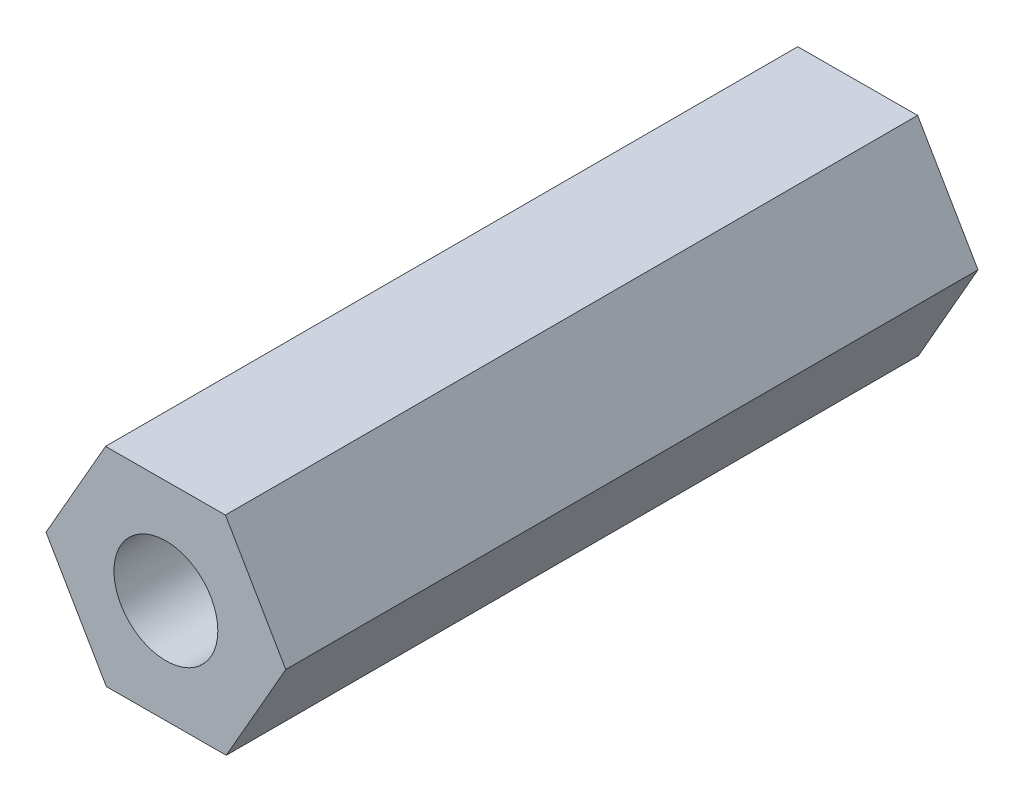
ISO-10303-21;
HEADER;
FILE_DESCRIPTION(('STEP AP214'),'2;1');
FILE_NAME('part.step','',(''),(''),'','','');
FILE_SCHEMA(('AUTOMOTIVE_DESIGN { 1 0 10303 214 1 1 1 1 }'));
ENDSEC;
DATA;
#1=APPLICATION_CONTEXT('core data for automotive mechanical design processes');
#2=APPLICATION_PROTOCOL_DEFINITION('international standard','automotive_design',2000,#1);
#3=PRODUCT_CONTEXT('',#1,'mechanical');
#4=PRODUCT('Part','Part','',(#3));
#5=PRODUCT_RELATED_PRODUCT_CATEGORY('part','',(#4));
#6=PRODUCT_DEFINITION_FORMATION('','',#4);
#7=PRODUCT_DEFINITION_CONTEXT('part definition',#1,'design');
#8=PRODUCT_DEFINITION('design','',#6,#7);
#9=PRODUCT_DEFINITION_SHAPE('','',#8);
#10=(LENGTH_UNIT() NAMED_UNIT(*) SI_UNIT(.MILLI.,.METRE.));
#11=(NAMED_UNIT(*) PLANE_ANGLE_UNIT() SI_UNIT($,.RADIAN.));
#12=(NAMED_UNIT(*) SI_UNIT($,.STERADIAN.) SOLID_ANGLE_UNIT());
#13=UNCERTAINTY_MEASURE_WITH_UNIT(LENGTH_MEASURE(1.E-05),#10,'distance_accuracy_value','');
#14=(GEOMETRIC_REPRESENTATION_CONTEXT(3) GLOBAL_UNCERTAINTY_ASSIGNED_CONTEXT((#13)) GLOBAL_UNIT_ASSIGNED_CONTEXT((#10,
#11,#12)) REPRESENTATION_CONTEXT('',''));
#15=CARTESIAN_POINT('',(0.,0.,0.));
#16=DIRECTION('',(0.,0.,1.));
#17=DIRECTION('',(1.,0.,0.));
#18=AXIS2_PLACEMENT_3D('',#15,#16,#17);
#19=CARTESIAN_POINT('',(0.,0.,20.));
#20=DIRECTION('',(0.,0.,1.));
#21=DIRECTION('',(1.,0.,0.));
#22=AXIS2_PLACEMENT_3D('',#19,#20,#21);
#23=PLANE('',#22);
#24=DIRECTION('',(-0.503453158414785,0.864022521281811,0.));
#25=VECTOR('',#24,1.);
#26=CARTESIAN_POINT('',(3.46407401345086,0.0138285695004978,20.));
#27=LINE('',#26,#25);
#28=CARTESIAN_POINT('',(3.46407401345086,0.0138285695004978,20.));
#29=VERTEX_POINT('',#28);
#30=CARTESIAN_POINT('',(1.72006111424,3.00689038098821,20.));
#31=VERTEX_POINT('',#30);
#32=EDGE_CURVE('E131',#29,#31,#27,.T.);
#33=ORIENTED_EDGE('',*,*,#32,.T.);
#34=DIRECTION('',(-0.999992032079321,-0.00399196416180948,0.));
#35=VECTOR('',#34,1.);
#36=CARTESIAN_POINT('',(1.72006111424,3.00689038098821,20.));
#37=LINE('',#36,#35);
#38=CARTESIAN_POINT('',(-1.74401289921086,2.99306181148772,20.));
#39=VERTEX_POINT('',#38);
#40=EDGE_CURVE('E89',#31,#39,#37,.T.);
#41=ORIENTED_EDGE('',*,*,#40,.T.);
#42=DIRECTION('',(-0.496538873664536,-0.868014485443621,0.));
#43=VECTOR('',#42,1.);
#44=CARTESIAN_POINT('',(-1.74401289921086,2.99306181148772,20.));
#45=LINE('',#44,#43);
#46=CARTESIAN_POINT('',(-3.46407401345086,-0.0138285695004986,20.));
#47=VERTEX_POINT('',#46);
#48=EDGE_CURVE('E102',#39,#47,#45,.T.);
#49=ORIENTED_EDGE('',*,*,#48,.T.);
#50=DIRECTION('',(0.503453158414785,-0.864022521281811,0.));
#51=VECTOR('',#50,1.);
#52=CARTESIAN_POINT('',(-3.46407401345086,-0.0138285695004986,20.));
#53=LINE('',#52,#51);
#54=CARTESIAN_POINT('',(-1.72006111424,-3.00689038098821,20.));
#55=VERTEX_POINT('',#54);
#56=EDGE_CURVE('E96',#47,#55,#53,.T.);
#57=ORIENTED_EDGE('',*,*,#56,.T.);
#58=DIRECTION('',(0.999992032079322,0.00399196416180986,0.));
#59=VECTOR('',#58,1.);
#60=CARTESIAN_POINT('',(-1.72006111424,-3.00689038098821,20.));
#61=LINE('',#60,#59);
#62=CARTESIAN_POINT('',(1.74401289921086,-2.99306181148772,20.));
#63=VERTEX_POINT('',#62);
#64=EDGE_CURVE('E100',#55,#63,#61,.T.);
#65=ORIENTED_EDGE('',*,*,#64,.T.);
#66=DIRECTION('',(0.496538873664536,0.868014485443621,0.));
#67=VECTOR('',#66,1.);
#68=CARTESIAN_POINT('',(1.74401289921086,-2.99306181148772,20.));
#69=LINE('',#68,#67);
#70=EDGE_CURVE('E52',#63,#29,#69,.T.);
#71=ORIENTED_EDGE('',*,*,#70,.T.);
#72=EDGE_LOOP('',(#33,#41,#49,#57,#65,#71));
#73=FACE_BOUND('',#72,.T.);
#74=CARTESIAN_POINT('',(0.,0.,20.));
#75=DIRECTION('',(0.,0.,1.));
#76=DIRECTION('',(1.,0.,0.));
#77=AXIS2_PLACEMENT_3D('',#74,#75,#76);
#78=CIRCLE('',#77,1.5);
#79=CARTESIAN_POINT('',(1.5,0.,20.));
#80=VERTEX_POINT('',#79);
#81=EDGE_CURVE('E124',#80,#80,#78,.T.);
#82=ORIENTED_EDGE('',*,*,#81,.F.);
#83=EDGE_LOOP('',(#82));
#84=FACE_BOUND('',#83,.T.);
#85=ADVANCED_FACE('F35',(#73,#84),#23,.T.);
#86=CARTESIAN_POINT('',(0.,0.,0.));
#87=DIRECTION('',(0.,0.,1.));
#88=DIRECTION('',(1.,0.,0.));
#89=AXIS2_PLACEMENT_3D('',#86,#87,#88);
#90=PLANE('',#89);
#91=DIRECTION('',(-0.503453158414785,0.864022521281811,0.));
#92=VECTOR('',#91,1.);
#93=CARTESIAN_POINT('',(3.46407401345086,0.0138285695004978,0.));
#94=LINE('',#93,#92);
#95=CARTESIAN_POINT('',(3.46407401345086,0.0138285695004978,0.));
#96=VERTEX_POINT('',#95);
#97=CARTESIAN_POINT('',(1.72006111424,3.00689038098821,0.));
#98=VERTEX_POINT('',#97);
#99=EDGE_CURVE('E120',#96,#98,#94,.T.);
#100=ORIENTED_EDGE('',*,*,#99,.F.);
#101=DIRECTION('',(0.496538873664536,0.868014485443621,0.));
#102=VECTOR('',#101,1.);
#103=CARTESIAN_POINT('',(1.74401289921086,-2.99306181148772,0.));
#104=LINE('',#103,#102);
#105=CARTESIAN_POINT('',(1.74401289921086,-2.99306181148772,0.));
#106=VERTEX_POINT('',#105);
#107=EDGE_CURVE('E81',#106,#96,#104,.T.);
#108=ORIENTED_EDGE('',*,*,#107,.F.);
#109=DIRECTION('',(0.999992032079322,0.00399196416180986,0.));
#110=VECTOR('',#109,1.);
#111=CARTESIAN_POINT('',(-1.72006111424,-3.00689038098821,0.));
#112=LINE('',#111,#110);
#113=CARTESIAN_POINT('',(-1.72006111424,-3.00689038098821,0.));
#114=VERTEX_POINT('',#113);
#115=EDGE_CURVE('E75',#114,#106,#112,.T.);
#116=ORIENTED_EDGE('',*,*,#115,.F.);
#117=DIRECTION('',(0.503453158414785,-0.864022521281811,0.));
#118=VECTOR('',#117,1.);
#119=CARTESIAN_POINT('',(-3.46407401345086,-0.0138285695004986,0.));
#120=LINE('',#119,#118);
#121=CARTESIAN_POINT('',(-3.46407401345086,-0.0138285695004986,0.));
#122=VERTEX_POINT('',#121);
#123=EDGE_CURVE('E110',#122,#114,#120,.T.);
#124=ORIENTED_EDGE('',*,*,#123,.F.);
#125=DIRECTION('',(-0.496538873664536,-0.868014485443621,0.));
#126=VECTOR('',#125,1.);
#127=CARTESIAN_POINT('',(-1.74401289921086,2.99306181148772,0.));
#128=LINE('',#127,#126);
#129=CARTESIAN_POINT('',(-1.74401289921086,2.99306181148772,0.));
#130=VERTEX_POINT('',#129);
#131=EDGE_CURVE('E126',#130,#122,#128,.T.);
#132=ORIENTED_EDGE('',*,*,#131,.F.);
#133=DIRECTION('',(-0.999992032079321,-0.00399196416180948,0.));
#134=VECTOR('',#133,1.);
#135=CARTESIAN_POINT('',(1.72006111424,3.00689038098821,0.));
#136=LINE('',#135,#134);
#137=EDGE_CURVE('E123',#98,#130,#136,.T.);
#138=ORIENTED_EDGE('',*,*,#137,.F.);
#139=EDGE_LOOP('',(#100,#108,#116,#124,#132,#138));
#140=FACE_BOUND('',#139,.T.);
#141=CARTESIAN_POINT('',(0.,0.,0.));
#142=DIRECTION('',(0.,0.,1.));
#143=DIRECTION('',(1.,0.,0.));
#144=AXIS2_PLACEMENT_3D('',#141,#142,#143);
#145=CIRCLE('',#144,1.5);
#146=CARTESIAN_POINT('',(1.5,0.,0.));
#147=VERTEX_POINT('',#146);
#148=EDGE_CURVE('E224',#147,#147,#145,.T.);
#149=ORIENTED_EDGE('',*,*,#148,.T.);
#150=EDGE_LOOP('',(#149));
#151=FACE_BOUND('',#150,.T.);
#152=ADVANCED_FACE('F140',(#140,#151),#90,.F.);
#153=CARTESIAN_POINT('',(3.46407401345086,0.0138285695004978,20.));
#154=DIRECTION('',(-0.864022521281811,-0.503453158414785,0.));
#155=DIRECTION('',(0.503453158414785,-0.864022521281811,0.));
#156=AXIS2_PLACEMENT_3D('',#153,#154,#155);
#157=PLANE('',#156);
#158=ORIENTED_EDGE('',*,*,#99,.T.);
#159=DIRECTION('',(0.,0.,-1.));
#160=VECTOR('',#159,1.);
#161=CARTESIAN_POINT('',(1.72006111424,3.00689038098821,20.));
#162=LINE('',#161,#160);
#163=EDGE_CURVE('E11',#31,#98,#162,.T.);
#164=ORIENTED_EDGE('',*,*,#163,.F.);
#165=ORIENTED_EDGE('',*,*,#32,.F.);
#166=DIRECTION('',(0.,0.,-1.));
#167=VECTOR('',#166,1.);
#168=CARTESIAN_POINT('',(3.46407401345086,0.0138285695004978,20.));
#169=LINE('',#168,#167);
#170=EDGE_CURVE('E116',#29,#96,#169,.T.);
#171=ORIENTED_EDGE('',*,*,#170,.T.);
#172=EDGE_LOOP('',(#158,#164,#165,#171));
#173=FACE_BOUND('',#172,.T.);
#174=ADVANCED_FACE('F37',(#173),#157,.F.);
#175=CARTESIAN_POINT('',(1.72006111424,3.00689038098821,20.));
#176=DIRECTION('',(0.00399196416180948,-0.999992032079322,0.));
#177=DIRECTION('',(0.999992032079322,0.00399196416180948,0.));
#178=AXIS2_PLACEMENT_3D('',#175,#176,#177);
#179=PLANE('',#178);
#180=ORIENTED_EDGE('',*,*,#137,.T.);
#181=DIRECTION('',(0.,0.,-1.));
#182=VECTOR('',#181,1.);
#183=CARTESIAN_POINT('',(-1.74401289921086,2.99306181148772,20.));
#184=LINE('',#183,#182);
#185=EDGE_CURVE('E44',#39,#130,#184,.T.);
#186=ORIENTED_EDGE('',*,*,#185,.F.);
#187=ORIENTED_EDGE('',*,*,#40,.F.);
#188=ORIENTED_EDGE('',*,*,#163,.T.);
#189=EDGE_LOOP('',(#180,#186,#187,#188));
#190=FACE_BOUND('',#189,.T.);
#191=ADVANCED_FACE('F165',(#190),#179,.F.);
#192=CARTESIAN_POINT('',(-1.74401289921086,2.99306181148772,20.));
#193=DIRECTION('',(0.868014485443621,-0.496538873664536,0.));
#194=DIRECTION('',(0.496538873664536,0.868014485443621,0.));
#195=AXIS2_PLACEMENT_3D('',#192,#193,#194);
#196=PLANE('',#195);
#197=ORIENTED_EDGE('',*,*,#131,.T.);
#198=DIRECTION('',(0.,0.,-1.));
#199=VECTOR('',#198,1.);
#200=CARTESIAN_POINT('',(-3.46407401345086,-0.0138285695004986,20.));
#201=LINE('',#200,#199);
#202=EDGE_CURVE('E111',#47,#122,#201,.T.);
#203=ORIENTED_EDGE('',*,*,#202,.F.);
#204=ORIENTED_EDGE('',*,*,#48,.F.);
#205=ORIENTED_EDGE('',*,*,#185,.T.);
#206=EDGE_LOOP('',(#197,#203,#204,#205));
#207=FACE_BOUND('',#206,.T.);
#208=ADVANCED_FACE('F137',(#207),#196,.F.);
#209=CARTESIAN_POINT('',(-3.46407401345086,-0.0138285695004986,20.));
#210=DIRECTION('',(0.864022521281811,0.503453158414785,0.));
#211=DIRECTION('',(-0.503453158414785,0.864022521281811,0.));
#212=AXIS2_PLACEMENT_3D('',#209,#210,#211);
#213=PLANE('',#212);
#214=ORIENTED_EDGE('',*,*,#123,.T.);
#215=DIRECTION('',(0.,0.,-1.));
#216=VECTOR('',#215,1.);
#217=CARTESIAN_POINT('',(-1.72006111424,-3.00689038098821,20.));
#218=LINE('',#217,#216);
#219=EDGE_CURVE('E107',#55,#114,#218,.T.);
#220=ORIENTED_EDGE('',*,*,#219,.F.);
#221=ORIENTED_EDGE('',*,*,#56,.F.);
#222=ORIENTED_EDGE('',*,*,#202,.T.);
#223=EDGE_LOOP('',(#214,#220,#221,#222));
#224=FACE_BOUND('',#223,.T.);
#225=ADVANCED_FACE('F108',(#224),#213,.F.);
#226=CARTESIAN_POINT('',(-1.72006111424,-3.00689038098821,20.));
#227=DIRECTION('',(-0.00399196416180986,0.999992032079322,0.));
#228=DIRECTION('',(-0.999992032079322,-0.00399196416180986,0.));
#229=AXIS2_PLACEMENT_3D('',#226,#227,#228);
#230=PLANE('',#229);
#231=ORIENTED_EDGE('',*,*,#115,.T.);
#232=DIRECTION('',(0.,0.,-1.));
#233=VECTOR('',#232,1.);
#234=CARTESIAN_POINT('',(1.74401289921086,-2.99306181148772,20.));
#235=LINE('',#234,#233);
#236=EDGE_CURVE('E112',#63,#106,#235,.T.);
#237=ORIENTED_EDGE('',*,*,#236,.F.);
#238=ORIENTED_EDGE('',*,*,#64,.F.);
#239=ORIENTED_EDGE('',*,*,#219,.T.);
#240=EDGE_LOOP('',(#231,#237,#238,#239));
#241=FACE_BOUND('',#240,.T.);
#242=ADVANCED_FACE('F114',(#241),#230,.F.);
#243=CARTESIAN_POINT('',(1.74401289921086,-2.99306181148772,20.));
#244=DIRECTION('',(-0.868014485443621,0.496538873664536,0.));
#245=DIRECTION('',(-0.496538873664536,-0.868014485443621,0.));
#246=AXIS2_PLACEMENT_3D('',#243,#244,#245);
#247=PLANE('',#246);
#248=ORIENTED_EDGE('',*,*,#107,.T.);
#249=ORIENTED_EDGE('',*,*,#170,.F.);
#250=ORIENTED_EDGE('',*,*,#70,.F.);
#251=ORIENTED_EDGE('',*,*,#236,.T.);
#252=EDGE_LOOP('',(#248,#249,#250,#251));
#253=FACE_BOUND('',#252,.T.);
#254=ADVANCED_FACE('F145',(#253),#247,.F.);
#255=CARTESIAN_POINT('',(0.,0.,20.));
#256=DIRECTION('',(0.,0.,-1.));
#257=DIRECTION('',(-1.,0.,0.));
#258=AXIS2_PLACEMENT_3D('',#255,#256,#257);
#259=CYLINDRICAL_SURFACE('',#258,1.5);
#260=ORIENTED_EDGE('',*,*,#81,.T.);
#261=EDGE_LOOP('',(#260));
#262=FACE_BOUND('',#261,.T.);
#263=ORIENTED_EDGE('',*,*,#148,.F.);
#264=EDGE_LOOP('',(#263));
#265=FACE_BOUND('',#264,.T.);
#266=ADVANCED_FACE('F147',(#262,#265),#259,.F.);
#267=CLOSED_SHELL('',(#85,#152,#174,#191,#208,#225,#242,#254,#266));
#268=MANIFOLD_SOLID_BREP('B2',#267);
#269=ADVANCED_BREP_SHAPE_REPRESENTATION('',(#18,#268),#14);
#270=SHAPE_DEFINITION_REPRESENTATION(#9,#269);
ENDSEC;
END-ISO-10303-21;
